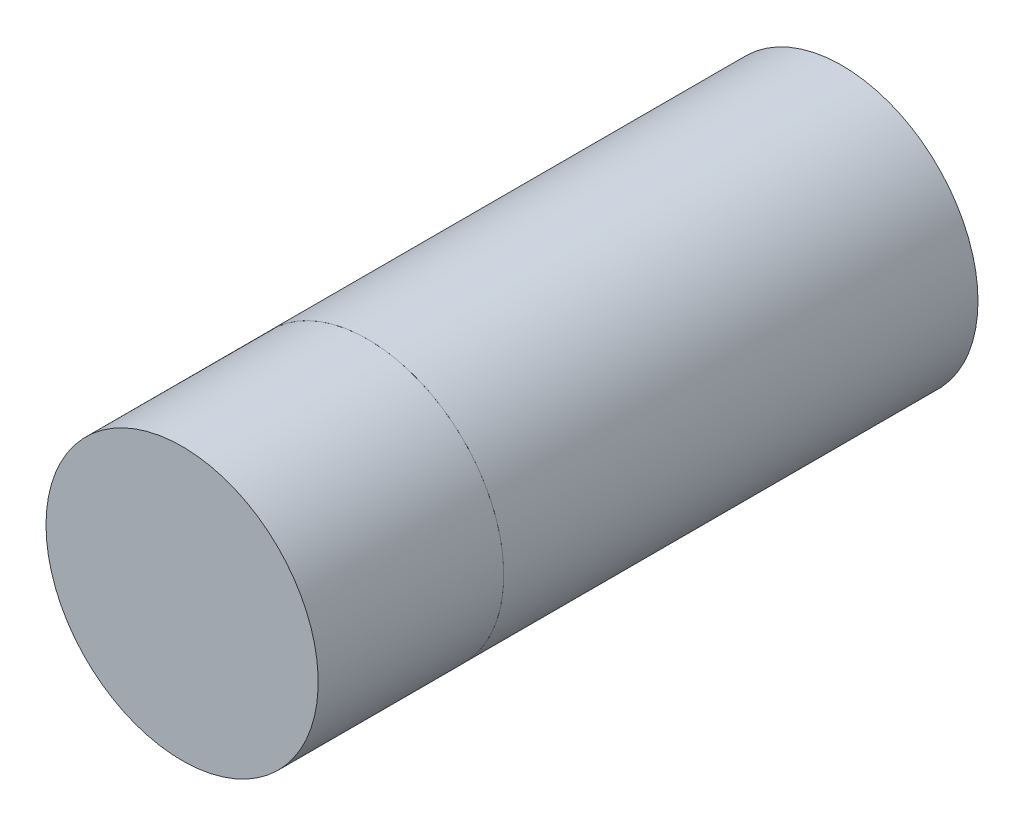
ISO-10303-21;
HEADER;
FILE_DESCRIPTION(('STEP AP214'),'2;1');
FILE_NAME('part.step','',(''),(''),'','','');
FILE_SCHEMA(('AUTOMOTIVE_DESIGN { 1 0 10303 214 1 1 1 1 }'));
ENDSEC;
DATA;
#1=APPLICATION_CONTEXT('core data for automotive mechanical design processes');
#2=APPLICATION_PROTOCOL_DEFINITION('international standard','automotive_design',2000,#1);
#3=PRODUCT_CONTEXT('',#1,'mechanical');
#4=PRODUCT('Part','Part','',(#3));
#5=PRODUCT_RELATED_PRODUCT_CATEGORY('part','',(#4));
#6=PRODUCT_DEFINITION_FORMATION('','',#4);
#7=PRODUCT_DEFINITION_CONTEXT('part definition',#1,'design');
#8=PRODUCT_DEFINITION('design','',#6,#7);
#9=PRODUCT_DEFINITION_SHAPE('','',#8);
#10=(LENGTH_UNIT() NAMED_UNIT(*) SI_UNIT(.MILLI.,.METRE.));
#11=(NAMED_UNIT(*) PLANE_ANGLE_UNIT() SI_UNIT($,.RADIAN.));
#12=(NAMED_UNIT(*) SI_UNIT($,.STERADIAN.) SOLID_ANGLE_UNIT());
#13=UNCERTAINTY_MEASURE_WITH_UNIT(LENGTH_MEASURE(1.E-05),#10,'distance_accuracy_value','');
#14=(GEOMETRIC_REPRESENTATION_CONTEXT(3) GLOBAL_UNCERTAINTY_ASSIGNED_CONTEXT((#13)) GLOBAL_UNIT_ASSIGNED_CONTEXT((#10,
#11,#12)) REPRESENTATION_CONTEXT('',''));
#15=CARTESIAN_POINT('',(0.,0.,0.));
#16=DIRECTION('',(0.,0.,1.));
#17=DIRECTION('',(1.,0.,0.));
#18=AXIS2_PLACEMENT_3D('',#15,#16,#17);
#19=CARTESIAN_POINT('',(0.,0.,160.));
#20=DIRECTION('',(0.,0.,-1.));
#21=DIRECTION('',(-1.,0.,0.));
#22=AXIS2_PLACEMENT_3D('',#19,#20,#21);
#23=CYLINDRICAL_SURFACE('',#22,33.);
#24=CARTESIAN_POINT('',(0.,0.,160.));
#25=DIRECTION('',(0.,0.,1.));
#26=DIRECTION('',(1.,0.,0.));
#27=AXIS2_PLACEMENT_3D('',#24,#25,#26);
#28=CIRCLE('',#27,33.);
#29=CARTESIAN_POINT('',(-33.,0.,160.));
#30=VERTEX_POINT('',#29);
#31=EDGE_CURVE('E13',#30,#30,#28,.T.);
#32=CARTESIAN_POINT('',(0.,0.,115.));
#33=DIRECTION('',(0.,0.,1.));
#34=DIRECTION('',(1.,0.,0.));
#35=AXIS2_PLACEMENT_3D('',#32,#33,#34);
#36=CIRCLE('',#35,33.);
#37=CARTESIAN_POINT('',(-33.,0.,115.));
#38=VERTEX_POINT('',#37);
#39=EDGE_CURVE('E57',#38,#38,#36,.T.);
#40=CARTESIAN_POINT('',(-33.,0.,160.));
#41=CARTESIAN_POINT('',(-33.,0.,159.53125));
#42=CARTESIAN_POINT('',(-33.,0.,159.0625));
#43=CARTESIAN_POINT('',(-33.,0.,158.125));
#44=CARTESIAN_POINT('',(-33.,0.,157.65625));
#45=CARTESIAN_POINT('',(-33.,0.,156.71875));
#46=CARTESIAN_POINT('',(-33.,0.,156.25));
#47=CARTESIAN_POINT('',(-33.,0.,155.3125));
#48=CARTESIAN_POINT('',(-33.,0.,154.84375));
#49=CARTESIAN_POINT('',(-33.,0.,153.90625));
#50=CARTESIAN_POINT('',(-33.,0.,153.4375));
#51=CARTESIAN_POINT('',(-33.,0.,152.5));
#52=CARTESIAN_POINT('',(-33.,0.,152.03125));
#53=CARTESIAN_POINT('',(-33.,0.,151.09375));
#54=CARTESIAN_POINT('',(-33.,0.,150.625));
#55=CARTESIAN_POINT('',(-33.,0.,149.6875));
#56=CARTESIAN_POINT('',(-33.,0.,149.21875));
#57=CARTESIAN_POINT('',(-33.,0.,148.28125));
#58=CARTESIAN_POINT('',(-33.,0.,147.8125));
#59=CARTESIAN_POINT('',(-33.,0.,146.875));
#60=CARTESIAN_POINT('',(-33.,0.,146.40625));
#61=CARTESIAN_POINT('',(-33.,0.,145.46875));
#62=CARTESIAN_POINT('',(-33.,0.,145.));
#63=CARTESIAN_POINT('',(-33.,0.,144.0625));
#64=CARTESIAN_POINT('',(-33.,0.,143.59375));
#65=CARTESIAN_POINT('',(-33.,0.,142.65625));
#66=CARTESIAN_POINT('',(-33.,0.,142.1875));
#67=CARTESIAN_POINT('',(-33.,0.,141.25));
#68=CARTESIAN_POINT('',(-33.,0.,140.78125));
#69=CARTESIAN_POINT('',(-33.,0.,139.84375));
#70=CARTESIAN_POINT('',(-33.,0.,139.375));
#71=CARTESIAN_POINT('',(-33.,0.,138.4375));
#72=CARTESIAN_POINT('',(-33.,0.,137.96875));
#73=CARTESIAN_POINT('',(-33.,0.,137.03125));
#74=CARTESIAN_POINT('',(-33.,0.,136.5625));
#75=CARTESIAN_POINT('',(-33.,0.,135.625));
#76=CARTESIAN_POINT('',(-33.,0.,135.15625));
#77=CARTESIAN_POINT('',(-33.,0.,134.21875));
#78=CARTESIAN_POINT('',(-33.,0.,133.75));
#79=CARTESIAN_POINT('',(-33.,0.,132.8125));
#80=CARTESIAN_POINT('',(-33.,0.,132.34375));
#81=CARTESIAN_POINT('',(-33.,0.,131.40625));
#82=CARTESIAN_POINT('',(-33.,0.,130.9375));
#83=CARTESIAN_POINT('',(-33.,0.,130.));
#84=CARTESIAN_POINT('',(-33.,0.,129.53125));
#85=CARTESIAN_POINT('',(-33.,0.,128.59375));
#86=CARTESIAN_POINT('',(-33.,0.,128.125));
#87=CARTESIAN_POINT('',(-33.,0.,127.1875));
#88=CARTESIAN_POINT('',(-33.,0.,126.71875));
#89=CARTESIAN_POINT('',(-33.,0.,125.78125));
#90=CARTESIAN_POINT('',(-33.,0.,125.3125));
#91=CARTESIAN_POINT('',(-33.,0.,124.375));
#92=CARTESIAN_POINT('',(-33.,0.,123.90625));
#93=CARTESIAN_POINT('',(-33.,0.,122.96875));
#94=CARTESIAN_POINT('',(-33.,0.,122.5));
#95=CARTESIAN_POINT('',(-33.,0.,121.5625));
#96=CARTESIAN_POINT('',(-33.,0.,121.09375));
#97=CARTESIAN_POINT('',(-33.,0.,120.15625));
#98=CARTESIAN_POINT('',(-33.,0.,119.6875));
#99=CARTESIAN_POINT('',(-33.,0.,118.75));
#100=CARTESIAN_POINT('',(-33.,0.,118.28125));
#101=CARTESIAN_POINT('',(-33.,0.,117.34375));
#102=CARTESIAN_POINT('',(-33.,0.,116.875));
#103=CARTESIAN_POINT('',(-33.,0.,115.9375));
#104=CARTESIAN_POINT('',(-33.,0.,115.46875));
#105=CARTESIAN_POINT('',(-33.,0.,115.));
#106=B_SPLINE_CURVE_WITH_KNOTS('',3,(#40,#41,#42,#43,#44,#45,#46,#47,#48,#49,#50,#51,#52,#53,
#54,#55,#56,#57,#58,#59,#60,#61,#62,#63,#64,#65,#66,#67,#68,#69,#70,#71,#72,#73,#74,#75,#76,#77,
#78,#79,#80,#81,#82,#83,#84,#85,#86,#87,#88,#89,#90,#91,#92,#93,#94,#95,#96,#97,#98,#99,#100,
#101,#102,#103,#104,#105),.UNSPECIFIED.,.F.,.F.,(4,2,2,2,2,2,2,2,2,2,2,2,2,2,2,2,2,2,2,2,2,2,2,
2,2,2,2,2,2,2,2,2,4),(0.,1.40625000000003,2.81250000000002,4.21875000000002,5.62500000000002,
7.03125000000002,8.43750000000001,9.84375000000001,11.25,12.65625,14.0625,15.46875,16.875,
18.28125,19.6875,21.09375,22.5,23.90625,25.3125,26.71875,28.125,29.53125,30.9375,32.34375,33.75,
35.15625,36.5625,37.96875,39.375,40.78125,42.1875,43.59375,45.),.UNSPECIFIED.);
#107=EDGE_CURVE('BSEAM54',#30,#38,#106,.T.);
#108=ORIENTED_EDGE('',*,*,#31,.F.);
#109=ORIENTED_EDGE('',*,*,#39,.T.);
#110=ORIENTED_EDGE('',*,*,#107,.T.);
#111=ORIENTED_EDGE('',*,*,#107,.F.);
#112=EDGE_LOOP('',(#108,#110,#109,#111));
#113=FACE_BOUND('',#112,.T.);
#114=ADVANCED_FACE('F54',(#113),#23,.T.);
#115=CARTESIAN_POINT('',(0.,0.,160.));
#116=DIRECTION('',(0.,0.,1.));
#117=DIRECTION('',(1.,0.,0.));
#118=AXIS2_PLACEMENT_3D('',#115,#116,#117);
#119=PLANE('',#118);
#120=ORIENTED_EDGE('',*,*,#31,.T.);
#121=EDGE_LOOP('',(#120));
#122=FACE_BOUND('',#121,.T.);
#123=ADVANCED_FACE('F69',(#122),#119,.T.);
#124=CARTESIAN_POINT('',(0.,0.,115.));
#125=DIRECTION('',(0.,0.,1.));
#126=DIRECTION('',(1.,0.,0.));
#127=AXIS2_PLACEMENT_3D('',#124,#125,#126);
#128=PLANE('',#127);
#129=ORIENTED_EDGE('',*,*,#39,.F.);
#130=EDGE_LOOP('',(#129));
#131=FACE_BOUND('',#130,.T.);
#132=ADVANCED_FACE('F67',(#131),#128,.F.);
#133=CLOSED_SHELL('',(#114,#123,#132));
#134=MANIFOLD_SOLID_BREP('B2',#133);
#135=CARTESIAN_POINT('',(0.,0.,115.));
#136=DIRECTION('',(0.,0.,-1.));
#137=DIRECTION('',(-1.,0.,0.));
#138=AXIS2_PLACEMENT_3D('',#135,#136,#137);
#139=CYLINDRICAL_SURFACE('',#138,33.);
#140=CARTESIAN_POINT('',(0.,0.,115.));
#141=DIRECTION('',(0.,0.,1.));
#142=DIRECTION('',(1.,0.,0.));
#143=AXIS2_PLACEMENT_3D('',#140,#141,#142);
#144=CIRCLE('',#143,33.);
#145=CARTESIAN_POINT('',(33.,0.,115.));
#146=VERTEX_POINT('',#145);
#147=EDGE_CURVE('E53',#146,#146,#144,.T.);
#148=ORIENTED_EDGE('',*,*,#147,.F.);
#149=EDGE_LOOP('',(#148));
#150=FACE_BOUND('',#149,.T.);
#151=CARTESIAN_POINT('',(0.,0.,0.));
#152=DIRECTION('',(0.,0.,1.));
#153=DIRECTION('',(1.,0.,0.));
#154=AXIS2_PLACEMENT_3D('',#151,#152,#153);
#155=CIRCLE('',#154,33.);
#156=CARTESIAN_POINT('',(33.,0.,0.));
#157=VERTEX_POINT('',#156);
#158=EDGE_CURVE('E103',#157,#157,#155,.T.);
#159=ORIENTED_EDGE('',*,*,#158,.T.);
#160=EDGE_LOOP('',(#159));
#161=FACE_BOUND('',#160,.T.);
#162=ADVANCED_FACE('F100',(#150,#161),#139,.T.);
#163=CARTESIAN_POINT('',(0.,0.,115.));
#164=DIRECTION('',(0.,0.,1.));
#165=DIRECTION('',(1.,0.,0.));
#166=AXIS2_PLACEMENT_3D('',#163,#164,#165);
#167=PLANE('',#166);
#168=ORIENTED_EDGE('',*,*,#147,.T.);
#169=EDGE_LOOP('',(#168));
#170=FACE_BOUND('',#169,.T.);
#171=ADVANCED_FACE('F115',(#170),#167,.T.);
#172=CARTESIAN_POINT('',(0.,0.,0.));
#173=DIRECTION('',(0.,0.,1.));
#174=DIRECTION('',(1.,0.,0.));
#175=AXIS2_PLACEMENT_3D('',#172,#173,#174);
#176=PLANE('',#175);
#177=ORIENTED_EDGE('',*,*,#158,.F.);
#178=EDGE_LOOP('',(#177));
#179=FACE_BOUND('',#178,.T.);
#180=ADVANCED_FACE('F113',(#179),#176,.F.);
#181=CLOSED_SHELL('',(#162,#171,#180));
#182=MANIFOLD_SOLID_BREP('B8',#181);
#183=ADVANCED_BREP_SHAPE_REPRESENTATION('',(#18,#134,#182),#14);
#184=SHAPE_DEFINITION_REPRESENTATION(#9,#183);
ENDSEC;
END-ISO-10303-21;
